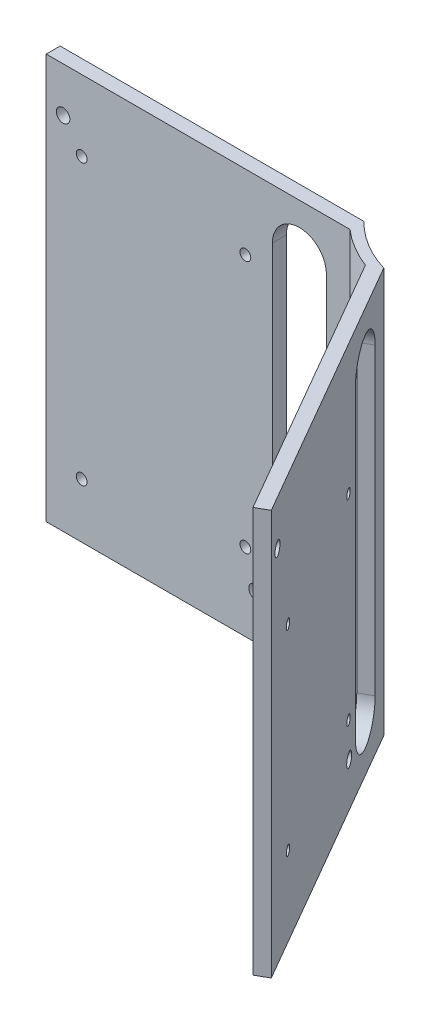
ISO-10303-21;
HEADER;
FILE_DESCRIPTION(('STEP AP214'),'2;1');
FILE_NAME('part.step','',(''),(''),'','','');
FILE_SCHEMA(('AUTOMOTIVE_DESIGN { 1 0 10303 214 1 1 1 1 }'));
ENDSEC;
DATA;
#1=APPLICATION_CONTEXT('core data for automotive mechanical design processes');
#2=APPLICATION_PROTOCOL_DEFINITION('international standard','automotive_design',2000,#1);
#3=PRODUCT_CONTEXT('',#1,'mechanical');
#4=PRODUCT('Part','Part','',(#3));
#5=PRODUCT_RELATED_PRODUCT_CATEGORY('part','',(#4));
#6=PRODUCT_DEFINITION_FORMATION('','',#4);
#7=PRODUCT_DEFINITION_CONTEXT('part definition',#1,'design');
#8=PRODUCT_DEFINITION('design','',#6,#7);
#9=PRODUCT_DEFINITION_SHAPE('','',#8);
#10=(LENGTH_UNIT() NAMED_UNIT(*) SI_UNIT(.MILLI.,.METRE.));
#11=(NAMED_UNIT(*) PLANE_ANGLE_UNIT() SI_UNIT($,.RADIAN.));
#12=(NAMED_UNIT(*) SI_UNIT($,.STERADIAN.) SOLID_ANGLE_UNIT());
#13=UNCERTAINTY_MEASURE_WITH_UNIT(LENGTH_MEASURE(1.E-05),#10,'distance_accuracy_value','');
#14=(GEOMETRIC_REPRESENTATION_CONTEXT(3) GLOBAL_UNCERTAINTY_ASSIGNED_CONTEXT((#13)) GLOBAL_UNIT_ASSIGNED_CONTEXT((#10,
#11,#12)) REPRESENTATION_CONTEXT('',''));
#15=CARTESIAN_POINT('',(0.,0.,0.));
#16=DIRECTION('',(0.,0.,1.));
#17=DIRECTION('',(1.,0.,0.));
#18=AXIS2_PLACEMENT_3D('',#15,#16,#17);
#19=CARTESIAN_POINT('',(0.,120.,28.6181760425084));
#20=DIRECTION('',(0.,0.,1.));
#21=DIRECTION('',(1.,0.,0.));
#22=AXIS2_PLACEMENT_3D('',#19,#20,#21);
#23=PLANE('',#22);
#24=CARTESIAN_POINT('',(-53.,13.,28.6181760425084));
#25=DIRECTION('',(0.,0.,1.));
#26=DIRECTION('',(1.,0.,0.));
#27=AXIS2_PLACEMENT_3D('',#24,#25,#26);
#28=CIRCLE('',#27,2.);
#29=CARTESIAN_POINT('',(-51.,13.,28.6181760425084));
#30=VERTEX_POINT('',#29);
#31=EDGE_CURVE('E691',#30,#30,#28,.T.);
#32=ORIENTED_EDGE('',*,*,#31,.F.);
#33=EDGE_LOOP('',(#32));
#34=FACE_BOUND('',#33,.T.);
#35=CARTESIAN_POINT('',(-104.5,16.199999999999,28.6181760425084));
#36=DIRECTION('',(0.,0.,1.));
#37=DIRECTION('',(1.,0.,0.));
#38=AXIS2_PLACEMENT_3D('',#35,#36,#37);
#39=CIRCLE('',#38,1.60000000000001);
#40=CARTESIAN_POINT('',(-102.9,16.199999999999,28.6181760425084));
#41=VERTEX_POINT('',#40);
#42=EDGE_CURVE('E714',#41,#41,#39,.T.);
#43=ORIENTED_EDGE('',*,*,#42,.F.);
#44=EDGE_LOOP('',(#43));
#45=FACE_BOUND('',#44,.T.);
#46=CARTESIAN_POINT('',(-56.0000000000009,97.9999999999995,28.6181760425084));
#47=DIRECTION('',(0.,0.,1.));
#48=DIRECTION('',(1.,0.,0.));
#49=AXIS2_PLACEMENT_3D('',#46,#47,#48);
#50=CIRCLE('',#49,1.6);
#51=CARTESIAN_POINT('',(-54.4000000000009,97.9999999999995,28.6181760425084));
#52=VERTEX_POINT('',#51);
#53=EDGE_CURVE('E705',#52,#52,#50,.T.);
#54=ORIENTED_EDGE('',*,*,#53,.F.);
#55=EDGE_LOOP('',(#54));
#56=FACE_BOUND('',#55,.T.);
#57=CARTESIAN_POINT('',(-104.500000000001,98.999999999999,28.6181760425084));
#58=DIRECTION('',(0.,0.,1.));
#59=DIRECTION('',(1.,0.,0.));
#60=AXIS2_PLACEMENT_3D('',#57,#58,#59);
#61=CIRCLE('',#60,1.6);
#62=CARTESIAN_POINT('',(-102.900000000001,98.999999999999,28.6181760425084));
#63=VERTEX_POINT('',#62);
#64=EDGE_CURVE('E697',#63,#63,#61,.T.);
#65=ORIENTED_EDGE('',*,*,#64,.F.);
#66=EDGE_LOOP('',(#65));
#67=FACE_BOUND('',#66,.T.);
#68=CARTESIAN_POINT('',(-56.0000000000001,22.9999999999995,28.6181760425084));
#69=DIRECTION('',(0.,0.,1.));
#70=DIRECTION('',(1.,0.,0.));
#71=AXIS2_PLACEMENT_3D('',#68,#69,#70);
#72=CIRCLE('',#71,1.6);
#73=CARTESIAN_POINT('',(-54.4000000000001,22.9999999999995,28.6181760425084));
#74=VERTEX_POINT('',#73);
#75=EDGE_CURVE('E713',#74,#74,#72,.T.);
#76=ORIENTED_EDGE('',*,*,#75,.F.);
#77=EDGE_LOOP('',(#76));
#78=FACE_BOUND('',#77,.T.);
#79=CARTESIAN_POINT('',(-110.,106.75,28.6181760425084));
#80=DIRECTION('',(0.,0.,1.));
#81=DIRECTION('',(1.,0.,0.));
#82=AXIS2_PLACEMENT_3D('',#79,#80,#81);
#83=CIRCLE('',#82,2.);
#84=CARTESIAN_POINT('',(-108.,106.75,28.6181760425084));
#85=VERTEX_POINT('',#84);
#86=EDGE_CURVE('E328',#85,#85,#83,.T.);
#87=ORIENTED_EDGE('',*,*,#86,.F.);
#88=EDGE_LOOP('',(#87));
#89=FACE_BOUND('',#88,.T.);
#90=CARTESIAN_POINT('',(-40.,105.,28.6181760425084));
#91=DIRECTION('',(0.,0.,1.));
#92=DIRECTION('',(-1.,0.,0.));
#93=AXIS2_PLACEMENT_3D('',#90,#91,#92);
#94=CIRCLE('',#93,8.);
#95=CARTESIAN_POINT('',(-32.,105.,28.6181760425084));
#96=VERTEX_POINT('',#95);
#97=CARTESIAN_POINT('',(-48.,105.,28.6181760425084));
#98=VERTEX_POINT('',#97);
#99=EDGE_CURVE('E185',#96,#98,#94,.T.);
#100=ORIENTED_EDGE('',*,*,#99,.F.);
#101=DIRECTION('',(0.,1.,0.));
#102=VECTOR('',#101,1.);
#103=CARTESIAN_POINT('',(-32.,105.,28.6181760425084));
#104=LINE('',#103,#102);
#105=CARTESIAN_POINT('',(-32.,15.,28.6181760425084));
#106=VERTEX_POINT('',#105);
#107=EDGE_CURVE('E195',#106,#96,#104,.T.);
#108=ORIENTED_EDGE('',*,*,#107,.F.);
#109=CARTESIAN_POINT('',(-40.,15.,28.6181760425084));
#110=DIRECTION('',(0.,0.,1.));
#111=DIRECTION('',(1.,0.,0.));
#112=AXIS2_PLACEMENT_3D('',#109,#110,#111);
#113=CIRCLE('',#112,8.00000000000001);
#114=CARTESIAN_POINT('',(-48.,15.,28.6181760425084));
#115=VERTEX_POINT('',#114);
#116=EDGE_CURVE('E214',#115,#106,#113,.T.);
#117=ORIENTED_EDGE('',*,*,#116,.F.);
#118=DIRECTION('',(0.,-1.,0.));
#119=VECTOR('',#118,1.);
#120=CARTESIAN_POINT('',(-48.,105.,28.6181760425084));
#121=LINE('',#120,#119);
#122=EDGE_CURVE('E210',#98,#115,#121,.T.);
#123=ORIENTED_EDGE('',*,*,#122,.F.);
#124=EDGE_LOOP('',(#100,#108,#117,#123));
#125=FACE_BOUND('',#124,.T.);
#126=DIRECTION('',(-1.,0.,0.));
#127=VECTOR('',#126,1.);
#128=CARTESIAN_POINT('',(0.,0.,28.6181760425084));
#129=LINE('',#128,#127);
#130=CARTESIAN_POINT('',(-25.,0.,28.6181760425084));
#131=VERTEX_POINT('',#130);
#132=CARTESIAN_POINT('',(-115.,0.,28.6181760425084));
#133=VERTEX_POINT('',#132);
#134=EDGE_CURVE('E224',#131,#133,#129,.T.);
#135=ORIENTED_EDGE('',*,*,#134,.F.);
#136=DIRECTION('',(0.,-1.,0.));
#137=VECTOR('',#136,1.);
#138=CARTESIAN_POINT('',(-25.,120.,28.6181760425084));
#139=LINE('',#138,#137);
#140=CARTESIAN_POINT('',(-25.,120.,28.6181760425084));
#141=VERTEX_POINT('',#140);
#142=EDGE_CURVE('E314',#141,#131,#139,.T.);
#143=ORIENTED_EDGE('',*,*,#142,.F.);
#144=DIRECTION('',(-1.,0.,0.));
#145=VECTOR('',#144,1.);
#146=CARTESIAN_POINT('',(0.,120.,28.6181760425084));
#147=LINE('',#146,#145);
#148=CARTESIAN_POINT('',(-115.,120.,28.6181760425084));
#149=VERTEX_POINT('',#148);
#150=EDGE_CURVE('E234',#141,#149,#147,.T.);
#151=ORIENTED_EDGE('',*,*,#150,.T.);
#152=DIRECTION('',(0.,-1.,0.));
#153=VECTOR('',#152,1.);
#154=CARTESIAN_POINT('',(-115.,120.,28.6181760425084));
#155=LINE('',#154,#153);
#156=EDGE_CURVE('E263',#149,#133,#155,.T.);
#157=ORIENTED_EDGE('',*,*,#156,.T.);
#158=EDGE_LOOP('',(#135,#143,#151,#157));
#159=FACE_BOUND('',#158,.T.);
#160=ADVANCED_FACE('F40',(#34,#45,#56,#67,#78,#89,#125,#159),#23,.T.);
#161=CARTESIAN_POINT('',(0.,120.,0.));
#162=DIRECTION('',(0.,-1.,0.));
#163=DIRECTION('',(0.,0.,-1.));
#164=AXIS2_PLACEMENT_3D('',#161,#162,#163);
#165=CYLINDRICAL_SURFACE('',#164,38.);
#166=CARTESIAN_POINT('',(0.,0.,0.));
#167=DIRECTION('',(0.,1.,0.));
#168=DIRECTION('',(0.,0.,1.));
#169=AXIS2_PLACEMENT_3D('',#166,#167,#168);
#170=CIRCLE('',#169,38.);
#171=CARTESIAN_POINT('',(-13.5526310368752,0.,35.5010731102361));
#172=VERTEX_POINT('',#171);
#173=EDGE_CURVE('E267',#131,#172,#170,.T.);
#174=ORIENTED_EDGE('',*,*,#173,.T.);
#175=DIRECTION('',(0.,-1.,0.));
#176=VECTOR('',#175,1.);
#177=CARTESIAN_POINT('',(-13.5526310368752,120.,35.5010731102361));
#178=LINE('',#177,#176);
#179=CARTESIAN_POINT('',(-13.5526310368752,120.,35.5010731102361));
#180=VERTEX_POINT('',#179);
#181=EDGE_CURVE('E310',#180,#172,#178,.T.);
#182=ORIENTED_EDGE('',*,*,#181,.F.);
#183=CARTESIAN_POINT('',(0.,120.,0.));
#184=DIRECTION('',(0.,1.,0.));
#185=DIRECTION('',(0.,0.,1.));
#186=AXIS2_PLACEMENT_3D('',#183,#184,#185);
#187=CIRCLE('',#186,38.);
#188=EDGE_CURVE('E238',#141,#180,#187,.T.);
#189=ORIENTED_EDGE('',*,*,#188,.F.);
#190=ORIENTED_EDGE('',*,*,#142,.T.);
#191=EDGE_LOOP('',(#174,#182,#189,#190));
#192=FACE_BOUND('',#191,.T.);
#193=ADVANCED_FACE('F368',(#192),#165,.T.);
#194=CARTESIAN_POINT('',(-25.5368888651929,120.,14.7437296605847));
#195=DIRECTION('',(0.866025403784439,0.,-0.5));
#196=DIRECTION('',(-0.5,0.,-0.866025403784439));
#197=AXIS2_PLACEMENT_3D('',#194,#195,#196);
#198=PLANE('',#197);
#199=CARTESIAN_POINT('',(0.447368963124837,13.,59.7497844162004));
#200=DIRECTION('',(-0.866025403784439,0.,0.5));
#201=DIRECTION('',(0.5,0.,0.866025403784439));
#202=AXIS2_PLACEMENT_3D('',#199,#200,#201);
#203=CIRCLE('',#202,2.00000000000001);
#204=CARTESIAN_POINT('',(1.44736896312484,13.,61.4818352237693));
#205=VERTEX_POINT('',#204);
#206=EDGE_CURVE('E687',#205,#205,#203,.T.);
#207=ORIENTED_EDGE('',*,*,#206,.F.);
#208=EDGE_LOOP('',(#207));
#209=FACE_BOUND('',#208,.T.);
#210=CARTESIAN_POINT('',(25.213111134807,81.585512482194,102.645308144705));
#211=DIRECTION('',(-0.866025403784439,0.,0.5));
#212=DIRECTION('',(0.5,0.,0.866025403784439));
#213=AXIS2_PLACEMENT_3D('',#210,#211,#212);
#214=CIRCLE('',#213,1.3644997127938);
#215=CARTESIAN_POINT('',(25.8953609912039,81.585512482194,103.826999559441));
#216=VERTEX_POINT('',#215);
#217=EDGE_CURVE('E729',#216,#216,#214,.T.);
#218=ORIENTED_EDGE('',*,*,#217,.F.);
#219=EDGE_LOOP('',(#218));
#220=FACE_BOUND('',#219,.T.);
#221=CARTESIAN_POINT('',(0.713111134806949,81.5855124821939,60.2100633592675));
#222=DIRECTION('',(-0.866025403784439,0.,0.5));
#223=DIRECTION('',(0.5,0.,0.866025403784439));
#224=AXIS2_PLACEMENT_3D('',#221,#222,#223);
#225=CIRCLE('',#224,1.3644997127938);
#226=CARTESIAN_POINT('',(1.39536099120385,81.5855124821939,61.3917547740035));
#227=VERTEX_POINT('',#226);
#228=EDGE_CURVE('E737',#227,#227,#225,.T.);
#229=ORIENTED_EDGE('',*,*,#228,.F.);
#230=EDGE_LOOP('',(#229));
#231=FACE_BOUND('',#230,.T.);
#232=CARTESIAN_POINT('',(0.71311113480705,23.5000000000009,60.2100633592677));
#233=DIRECTION('',(-0.866025403784439,0.,0.5));
#234=DIRECTION('',(0.5,0.,0.866025403784439));
#235=AXIS2_PLACEMENT_3D('',#232,#233,#234);
#236=CIRCLE('',#235,1.3644997127938);
#237=CARTESIAN_POINT('',(1.39536099120395,23.5000000000009,61.3917547740037));
#238=VERTEX_POINT('',#237);
#239=EDGE_CURVE('E733',#238,#238,#236,.T.);
#240=ORIENTED_EDGE('',*,*,#239,.F.);
#241=EDGE_LOOP('',(#240));
#242=FACE_BOUND('',#241,.T.);
#243=CARTESIAN_POINT('',(25.2131111348071,23.500000000001,102.645308144705));
#244=DIRECTION('',(-0.866025403784439,0.,0.5));
#245=DIRECTION('',(0.5,0.,0.866025403784439));
#246=AXIS2_PLACEMENT_3D('',#243,#244,#245);
#247=CIRCLE('',#246,1.3644997127938);
#248=CARTESIAN_POINT('',(25.895360991204,23.500000000001,103.826999559441));
#249=VERTEX_POINT('',#248);
#250=EDGE_CURVE('E335',#249,#249,#247,.T.);
#251=ORIENTED_EDGE('',*,*,#250,.F.);
#252=EDGE_LOOP('',(#251));
#253=FACE_BOUND('',#252,.T.);
#254=CARTESIAN_POINT('',(29.4631111348071,106.75,110.006524076873));
#255=DIRECTION('',(-0.866025403784439,0.,0.5));
#256=DIRECTION('',(0.5,0.,0.866025403784439));
#257=AXIS2_PLACEMENT_3D('',#254,#255,#256);
#258=CIRCLE('',#257,2.);
#259=CARTESIAN_POINT('',(30.4631111348071,106.75,111.738574884442));
#260=VERTEX_POINT('',#259);
#261=EDGE_CURVE('E329',#260,#260,#258,.T.);
#262=ORIENTED_EDGE('',*,*,#261,.F.);
#263=EDGE_LOOP('',(#262));
#264=FACE_BOUND('',#263,.T.);
#265=DIRECTION('',(0.,-1.,0.));
#266=VECTOR('',#265,1.);
#267=CARTESIAN_POINT('',(-10.0526310368752,105.,41.5632509367272));
#268=LINE('',#267,#266);
#269=CARTESIAN_POINT('',(-10.0526310368752,105.,41.5632509367272));
#270=VERTEX_POINT('',#269);
#271=CARTESIAN_POINT('',(-10.0526310368752,15.,41.5632509367272));
#272=VERTEX_POINT('',#271);
#273=EDGE_CURVE('E167',#270,#272,#268,.T.);
#274=ORIENTED_EDGE('',*,*,#273,.F.);
#275=CARTESIAN_POINT('',(-6.05263103687518,105.,48.4914541670027));
#276=DIRECTION('',(-0.866025403784439,0.,0.5));
#277=DIRECTION('',(0.5,0.,0.866025403784439));
#278=AXIS2_PLACEMENT_3D('',#275,#276,#277);
#279=CIRCLE('',#278,8.);
#280=CARTESIAN_POINT('',(-2.05263103687518,105.,55.4196573972782));
#281=VERTEX_POINT('',#280);
#282=EDGE_CURVE('E57',#281,#270,#279,.T.);
#283=ORIENTED_EDGE('',*,*,#282,.F.);
#284=DIRECTION('',(0.,1.,0.));
#285=VECTOR('',#284,1.);
#286=CARTESIAN_POINT('',(-2.05263103687518,105.,55.4196573972782));
#287=LINE('',#286,#285);
#288=CARTESIAN_POINT('',(-2.05263103687518,15.,55.4196573972782));
#289=VERTEX_POINT('',#288);
#290=EDGE_CURVE('E175',#289,#281,#287,.T.);
#291=ORIENTED_EDGE('',*,*,#290,.F.);
#292=CARTESIAN_POINT('',(-6.05263103687518,15.,48.4914541670027));
#293=DIRECTION('',(-0.866025403784439,0.,0.5));
#294=DIRECTION('',(-0.5,0.,-0.866025403784439));
#295=AXIS2_PLACEMENT_3D('',#292,#293,#294);
#296=CIRCLE('',#295,8.);
#297=EDGE_CURVE('E157',#272,#289,#296,.T.);
#298=ORIENTED_EDGE('',*,*,#297,.F.);
#299=EDGE_LOOP('',(#274,#283,#291,#298));
#300=FACE_BOUND('',#299,.T.);
#301=DIRECTION('',(0.5,0.,0.866025403784439));
#302=VECTOR('',#301,1.);
#303=CARTESIAN_POINT('',(-25.5368888651929,0.,14.7437296605847));
#304=LINE('',#303,#302);
#305=CARTESIAN_POINT('',(31.9631111348071,0.,114.336651095795));
#306=VERTEX_POINT('',#305);
#307=EDGE_CURVE('E270',#172,#306,#304,.T.);
#308=ORIENTED_EDGE('',*,*,#307,.T.);
#309=DIRECTION('',(0.,-1.,0.));
#310=VECTOR('',#309,1.);
#311=CARTESIAN_POINT('',(31.9631111348071,120.,114.336651095795));
#312=LINE('',#311,#310);
#313=CARTESIAN_POINT('',(31.9631111348071,120.,114.336651095795));
#314=VERTEX_POINT('',#313);
#315=EDGE_CURVE('E306',#314,#306,#312,.T.);
#316=ORIENTED_EDGE('',*,*,#315,.F.);
#317=DIRECTION('',(0.5,0.,0.866025403784439));
#318=VECTOR('',#317,1.);
#319=CARTESIAN_POINT('',(-25.5368888651929,120.,14.7437296605847));
#320=LINE('',#319,#318);
#321=EDGE_CURVE('E242',#180,#314,#320,.T.);
#322=ORIENTED_EDGE('',*,*,#321,.F.);
#323=ORIENTED_EDGE('',*,*,#181,.T.);
#324=EDGE_LOOP('',(#308,#316,#322,#323));
#325=FACE_BOUND('',#324,.T.);
#326=ADVANCED_FACE('F172',(#209,#220,#231,#242,#253,#264,#300,#325),#198,.F.);
#327=CARTESIAN_POINT('',(57.5000000000002,120.,99.5929214352103));
#328=DIRECTION('',(-0.500000000000002,0.,-0.866025403784438));
#329=DIRECTION('',(-0.866025403784438,0.,0.500000000000002));
#330=AXIS2_PLACEMENT_3D('',#327,#328,#329);
#331=PLANE('',#330);
#332=DIRECTION('',(0.866025403784438,0.,-0.500000000000002));
#333=VECTOR('',#332,1.);
#334=CARTESIAN_POINT('',(57.5000000000002,0.,99.5929214352103));
#335=LINE('',#334,#333);
#336=CARTESIAN_POINT('',(35.411933246361,0.,112.345472721302));
#337=VERTEX_POINT('',#336);
#338=EDGE_CURVE('E273',#306,#337,#335,.T.);
#339=ORIENTED_EDGE('',*,*,#338,.T.);
#340=DIRECTION('',(0.,-1.,0.));
#341=VECTOR('',#340,1.);
#342=CARTESIAN_POINT('',(35.411933246361,120.,112.345472721302));
#343=LINE('',#342,#341);
#344=CARTESIAN_POINT('',(35.411933246361,120.,112.345472721302));
#345=VERTEX_POINT('',#344);
#346=EDGE_CURVE('E303',#345,#337,#343,.T.);
#347=ORIENTED_EDGE('',*,*,#346,.F.);
#348=DIRECTION('',(0.866025403784438,0.,-0.500000000000002));
#349=VECTOR('',#348,1.);
#350=CARTESIAN_POINT('',(57.5000000000002,120.,99.5929214352103));
#351=LINE('',#350,#349);
#352=EDGE_CURVE('E245',#314,#345,#351,.T.);
#353=ORIENTED_EDGE('',*,*,#352,.F.);
#354=ORIENTED_EDGE('',*,*,#315,.T.);
#355=EDGE_LOOP('',(#339,#347,#353,#354));
#356=FACE_BOUND('',#355,.T.);
#357=ADVANCED_FACE('F400',(#356),#331,.F.);
#358=CARTESIAN_POINT('',(-22.0880667536391,120.,12.752551286092));
#359=DIRECTION('',(0.866025403784438,0.,-0.5));
#360=DIRECTION('',(-0.5,0.,-0.866025403784438));
#361=AXIS2_PLACEMENT_3D('',#358,#359,#360);
#362=PLANE('',#361);
#363=CARTESIAN_POINT('',(3.89619107467871,13.,57.7586060417077));
#364=DIRECTION('',(0.866025403784438,0.,-0.5));
#365=DIRECTION('',(-0.5,0.,-0.866025403784438));
#366=AXIS2_PLACEMENT_3D('',#363,#364,#365);
#367=CIRCLE('',#366,2.00000000000001);
#368=CARTESIAN_POINT('',(2.8961910746787,13.,56.0265552341388));
#369=VERTEX_POINT('',#368);
#370=EDGE_CURVE('E43',#369,#369,#367,.T.);
#371=ORIENTED_EDGE('',*,*,#370,.F.);
#372=EDGE_LOOP('',(#371));
#373=FACE_BOUND('',#372,.T.);
#374=CARTESIAN_POINT('',(28.6619332463608,81.585512482194,100.654129770212));
#375=DIRECTION('',(0.866025403784438,0.,-0.5));
#376=DIRECTION('',(-0.5,0.,-0.866025403784438));
#377=AXIS2_PLACEMENT_3D('',#374,#375,#376);
#378=CIRCLE('',#377,1.3644997127938);
#379=CARTESIAN_POINT('',(27.9796833899639,81.585512482194,99.4724383554763));
#380=VERTEX_POINT('',#379);
#381=EDGE_CURVE('E342',#380,#380,#378,.T.);
#382=ORIENTED_EDGE('',*,*,#381,.F.);
#383=EDGE_LOOP('',(#382));
#384=FACE_BOUND('',#383,.T.);
#385=CARTESIAN_POINT('',(4.16193324636082,81.5855124821939,58.2188849847748));
#386=DIRECTION('',(0.866025403784438,0.,-0.5));
#387=DIRECTION('',(-0.5,0.,-0.866025403784438));
#388=AXIS2_PLACEMENT_3D('',#385,#386,#387);
#389=CIRCLE('',#388,1.3644997127938);
#390=CARTESIAN_POINT('',(3.47968338996392,81.5855124821939,57.0371935700388));
#391=VERTEX_POINT('',#390);
#392=EDGE_CURVE('E339',#391,#391,#389,.T.);
#393=ORIENTED_EDGE('',*,*,#392,.F.);
#394=EDGE_LOOP('',(#393));
#395=FACE_BOUND('',#394,.T.);
#396=CARTESIAN_POINT('',(4.16193324636092,23.5000000000009,58.2188849847749));
#397=DIRECTION('',(0.866025403784438,0.,-0.5));
#398=DIRECTION('',(-0.5,0.,-0.866025403784438));
#399=AXIS2_PLACEMENT_3D('',#396,#397,#398);
#400=CIRCLE('',#399,1.3644997127938);
#401=CARTESIAN_POINT('',(3.47968338996402,23.5000000000009,57.0371935700389));
#402=VERTEX_POINT('',#401);
#403=EDGE_CURVE('E334',#402,#402,#400,.T.);
#404=ORIENTED_EDGE('',*,*,#403,.F.);
#405=EDGE_LOOP('',(#404));
#406=FACE_BOUND('',#405,.T.);
#407=CARTESIAN_POINT('',(28.6619332463609,23.500000000001,100.654129770212));
#408=DIRECTION('',(0.866025403784438,0.,-0.5));
#409=DIRECTION('',(-0.5,0.,-0.866025403784438));
#410=AXIS2_PLACEMENT_3D('',#407,#408,#409);
#411=CIRCLE('',#410,1.3644997127938);
#412=CARTESIAN_POINT('',(27.979683389964,23.500000000001,99.4724383554764));
#413=VERTEX_POINT('',#412);
#414=EDGE_CURVE('E330',#413,#413,#411,.T.);
#415=ORIENTED_EDGE('',*,*,#414,.F.);
#416=EDGE_LOOP('',(#415));
#417=FACE_BOUND('',#416,.T.);
#418=CARTESIAN_POINT('',(32.911933246361,106.75,108.01534570238));
#419=DIRECTION('',(0.866025403784438,0.,-0.5));
#420=DIRECTION('',(-0.5,0.,-0.866025403784438));
#421=AXIS2_PLACEMENT_3D('',#418,#419,#420);
#422=CIRCLE('',#421,2.);
#423=CARTESIAN_POINT('',(31.911933246361,106.75,106.283294894811));
#424=VERTEX_POINT('',#423);
#425=EDGE_CURVE('E324',#424,#424,#422,.T.);
#426=ORIENTED_EDGE('',*,*,#425,.F.);
#427=EDGE_LOOP('',(#426));
#428=FACE_BOUND('',#427,.T.);
#429=CARTESIAN_POINT('',(-2.60380892532131,105.,46.5002757925099));
#430=DIRECTION('',(0.866025403784438,0.,-0.5));
#431=DIRECTION('',(-0.5,0.,-0.866025403784438));
#432=AXIS2_PLACEMENT_3D('',#429,#430,#431);
#433=CIRCLE('',#432,8.);
#434=CARTESIAN_POINT('',(-6.60380892532132,105.,39.5720725622344));
#435=VERTEX_POINT('',#434);
#436=CARTESIAN_POINT('',(1.39619107467868,105.,53.4284790227854));
#437=VERTEX_POINT('',#436);
#438=EDGE_CURVE('E11',#435,#437,#433,.T.);
#439=ORIENTED_EDGE('',*,*,#438,.F.);
#440=DIRECTION('',(0.,1.,0.));
#441=VECTOR('',#440,1.);
#442=CARTESIAN_POINT('',(-6.60380892532132,120.,39.5720725622344));
#443=LINE('',#442,#441);
#444=CARTESIAN_POINT('',(-6.60380892532131,15.,39.5720725622344));
#445=VERTEX_POINT('',#444);
#446=EDGE_CURVE('E317',#445,#435,#443,.T.);
#447=ORIENTED_EDGE('',*,*,#446,.F.);
#448=CARTESIAN_POINT('',(-2.60380892532131,15.,46.5002757925099));
#449=DIRECTION('',(0.866025403784438,0.,-0.5));
#450=DIRECTION('',(-0.5,0.,-0.866025403784438));
#451=AXIS2_PLACEMENT_3D('',#448,#449,#450);
#452=CIRCLE('',#451,8.);
#453=CARTESIAN_POINT('',(1.39619107467869,15.,53.4284790227854));
#454=VERTEX_POINT('',#453);
#455=EDGE_CURVE('E160',#454,#445,#452,.T.);
#456=ORIENTED_EDGE('',*,*,#455,.F.);
#457=DIRECTION('',(0.,-1.,0.));
#458=VECTOR('',#457,1.);
#459=CARTESIAN_POINT('',(1.39619107467869,120.,53.4284790227854));
#460=LINE('',#459,#458);
#461=EDGE_CURVE('E49',#437,#454,#460,.T.);
#462=ORIENTED_EDGE('',*,*,#461,.F.);
#463=EDGE_LOOP('',(#439,#447,#456,#462));
#464=FACE_BOUND('',#463,.T.);
#465=DIRECTION('',(0.5,0.,0.866025403784438));
#466=VECTOR('',#465,1.);
#467=CARTESIAN_POINT('',(-22.0880667536391,0.,12.752551286092));
#468=LINE('',#467,#466);
#469=CARTESIAN_POINT('',(-10.1038089253213,0.,33.5098947357433));
#470=VERTEX_POINT('',#469);
#471=EDGE_CURVE('E277',#470,#337,#468,.T.);
#472=ORIENTED_EDGE('',*,*,#471,.F.);
#473=DIRECTION('',(0.,-1.,0.));
#474=VECTOR('',#473,1.);
#475=CARTESIAN_POINT('',(-10.1038089253213,120.,33.5098947357433));
#476=LINE('',#475,#474);
#477=CARTESIAN_POINT('',(-10.1038089253213,120.,33.5098947357433));
#478=VERTEX_POINT('',#477);
#479=EDGE_CURVE('E300',#478,#470,#476,.T.);
#480=ORIENTED_EDGE('',*,*,#479,.F.);
#481=DIRECTION('',(0.5,0.,0.866025403784438));
#482=VECTOR('',#481,1.);
#483=CARTESIAN_POINT('',(-22.0880667536391,120.,12.752551286092));
#484=LINE('',#483,#482);
#485=EDGE_CURVE('E248',#478,#345,#484,.T.);
#486=ORIENTED_EDGE('',*,*,#485,.T.);
#487=ORIENTED_EDGE('',*,*,#346,.T.);
#488=EDGE_LOOP('',(#472,#480,#486,#487));
#489=FACE_BOUND('',#488,.T.);
#490=ADVANCED_FACE('F396',(#373,#384,#395,#406,#417,#428,#464,#489),#362,.T.);
#491=CARTESIAN_POINT('',(0.,120.,0.));
#492=DIRECTION('',(0.,-1.,0.));
#493=DIRECTION('',(0.,0.,-1.));
#494=AXIS2_PLACEMENT_3D('',#491,#492,#493);
#495=CYLINDRICAL_SURFACE('',#494,35.);
#496=CARTESIAN_POINT('',(0.,0.,0.));
#497=DIRECTION('',(0.,1.,0.));
#498=DIRECTION('',(0.,0.,1.));
#499=AXIS2_PLACEMENT_3D('',#496,#497,#498);
#500=CIRCLE('',#499,35.);
#501=CARTESIAN_POINT('',(-25.,0.,24.4948974278318));
#502=VERTEX_POINT('',#501);
#503=EDGE_CURVE('E281',#502,#470,#500,.T.);
#504=ORIENTED_EDGE('',*,*,#503,.F.);
#505=DIRECTION('',(0.,-1.,0.));
#506=VECTOR('',#505,1.);
#507=CARTESIAN_POINT('',(-25.,120.,24.4948974278318));
#508=LINE('',#507,#506);
#509=CARTESIAN_POINT('',(-25.,120.,24.4948974278318));
#510=VERTEX_POINT('',#509);
#511=EDGE_CURVE('E297',#510,#502,#508,.T.);
#512=ORIENTED_EDGE('',*,*,#511,.F.);
#513=CARTESIAN_POINT('',(0.,120.,0.));
#514=DIRECTION('',(0.,1.,0.));
#515=DIRECTION('',(0.,0.,1.));
#516=AXIS2_PLACEMENT_3D('',#513,#514,#515);
#517=CIRCLE('',#516,35.);
#518=EDGE_CURVE('E252',#510,#478,#517,.T.);
#519=ORIENTED_EDGE('',*,*,#518,.T.);
#520=ORIENTED_EDGE('',*,*,#479,.T.);
#521=EDGE_LOOP('',(#504,#512,#519,#520));
#522=FACE_BOUND('',#521,.T.);
#523=ADVANCED_FACE('F391',(#522),#495,.F.);
#524=CARTESIAN_POINT('',(0.,120.,24.4948974278318));
#525=DIRECTION('',(0.,0.,1.));
#526=DIRECTION('',(1.,0.,0.));
#527=AXIS2_PLACEMENT_3D('',#524,#525,#526);
#528=PLANE('',#527);
#529=CARTESIAN_POINT('',(-53.,13.,24.4948974278318));
#530=DIRECTION('',(0.,0.,1.));
#531=DIRECTION('',(1.,0.,0.));
#532=AXIS2_PLACEMENT_3D('',#529,#530,#531);
#533=CIRCLE('',#532,2.);
#534=CARTESIAN_POINT('',(-51.,13.,24.4948974278318));
#535=VERTEX_POINT('',#534);
#536=EDGE_CURVE('E693',#535,#535,#533,.T.);
#537=ORIENTED_EDGE('',*,*,#536,.T.);
#538=EDGE_LOOP('',(#537));
#539=FACE_BOUND('',#538,.T.);
#540=CARTESIAN_POINT('',(-104.5,16.199999999999,24.4948974278318));
#541=DIRECTION('',(0.,0.,1.));
#542=DIRECTION('',(1.,0.,0.));
#543=AXIS2_PLACEMENT_3D('',#540,#541,#542);
#544=CIRCLE('',#543,1.60000000000001);
#545=CARTESIAN_POINT('',(-102.9,16.199999999999,24.4948974278318));
#546=VERTEX_POINT('',#545);
#547=EDGE_CURVE('E709',#546,#546,#544,.T.);
#548=ORIENTED_EDGE('',*,*,#547,.T.);
#549=EDGE_LOOP('',(#548));
#550=FACE_BOUND('',#549,.T.);
#551=CARTESIAN_POINT('',(-56.0000000000009,97.9999999999995,24.4948974278318));
#552=DIRECTION('',(0.,0.,1.));
#553=DIRECTION('',(1.,0.,0.));
#554=AXIS2_PLACEMENT_3D('',#551,#552,#553);
#555=CIRCLE('',#554,1.6);
#556=CARTESIAN_POINT('',(-54.4000000000009,97.9999999999995,24.4948974278318));
#557=VERTEX_POINT('',#556);
#558=EDGE_CURVE('E718',#557,#557,#555,.T.);
#559=ORIENTED_EDGE('',*,*,#558,.T.);
#560=EDGE_LOOP('',(#559));
#561=FACE_BOUND('',#560,.T.);
#562=CARTESIAN_POINT('',(-104.500000000001,98.999999999999,24.4948974278318));
#563=DIRECTION('',(0.,0.,1.));
#564=DIRECTION('',(1.,0.,0.));
#565=AXIS2_PLACEMENT_3D('',#562,#563,#564);
#566=CIRCLE('',#565,1.6);
#567=CARTESIAN_POINT('',(-102.900000000001,98.999999999999,24.4948974278318));
#568=VERTEX_POINT('',#567);
#569=EDGE_CURVE('E701',#568,#568,#566,.T.);
#570=ORIENTED_EDGE('',*,*,#569,.T.);
#571=EDGE_LOOP('',(#570));
#572=FACE_BOUND('',#571,.T.);
#573=CARTESIAN_POINT('',(-56.0000000000001,22.9999999999995,24.4948974278318));
#574=DIRECTION('',(0.,0.,1.));
#575=DIRECTION('',(1.,0.,0.));
#576=AXIS2_PLACEMENT_3D('',#573,#574,#575);
#577=CIRCLE('',#576,1.6);
#578=CARTESIAN_POINT('',(-54.4000000000001,22.9999999999995,24.4948974278318));
#579=VERTEX_POINT('',#578);
#580=EDGE_CURVE('E725',#579,#579,#577,.T.);
#581=ORIENTED_EDGE('',*,*,#580,.T.);
#582=EDGE_LOOP('',(#581));
#583=FACE_BOUND('',#582,.T.);
#584=CARTESIAN_POINT('',(-110.,106.75,24.4948974278318));
#585=DIRECTION('',(0.,0.,1.));
#586=DIRECTION('',(1.,0.,0.));
#587=AXIS2_PLACEMENT_3D('',#584,#585,#586);
#588=CIRCLE('',#587,2.);
#589=CARTESIAN_POINT('',(-108.,106.75,24.4948974278318));
#590=VERTEX_POINT('',#589);
#591=EDGE_CURVE('E355',#590,#590,#588,.T.);
#592=ORIENTED_EDGE('',*,*,#591,.T.);
#593=EDGE_LOOP('',(#592));
#594=FACE_BOUND('',#593,.T.);
#595=DIRECTION('',(0.,1.,0.));
#596=VECTOR('',#595,1.);
#597=CARTESIAN_POINT('',(-32.,105.,24.4948974278318));
#598=LINE('',#597,#596);
#599=CARTESIAN_POINT('',(-32.,15.,24.4948974278318));
#600=VERTEX_POINT('',#599);
#601=CARTESIAN_POINT('',(-32.,105.,24.4948974278318));
#602=VERTEX_POINT('',#601);
#603=EDGE_CURVE('E203',#600,#602,#598,.T.);
#604=ORIENTED_EDGE('',*,*,#603,.T.);
#605=CARTESIAN_POINT('',(-40.,105.,24.4948974278318));
#606=DIRECTION('',(0.,0.,1.));
#607=DIRECTION('',(-1.,0.,0.));
#608=AXIS2_PLACEMENT_3D('',#605,#606,#607);
#609=CIRCLE('',#608,8.);
#610=CARTESIAN_POINT('',(-48.,105.,24.4948974278318));
#611=VERTEX_POINT('',#610);
#612=EDGE_CURVE('E190',#602,#611,#609,.T.);
#613=ORIENTED_EDGE('',*,*,#612,.T.);
#614=DIRECTION('',(0.,-1.,0.));
#615=VECTOR('',#614,1.);
#616=CARTESIAN_POINT('',(-48.,105.,24.4948974278318));
#617=LINE('',#616,#615);
#618=CARTESIAN_POINT('',(-48.,15.,24.4948974278318));
#619=VERTEX_POINT('',#618);
#620=EDGE_CURVE('E194',#611,#619,#617,.T.);
#621=ORIENTED_EDGE('',*,*,#620,.T.);
#622=CARTESIAN_POINT('',(-40.,15.,24.4948974278318));
#623=DIRECTION('',(0.,0.,1.));
#624=DIRECTION('',(1.,0.,0.));
#625=AXIS2_PLACEMENT_3D('',#622,#623,#624);
#626=CIRCLE('',#625,8.00000000000001);
#627=EDGE_CURVE('E199',#619,#600,#626,.T.);
#628=ORIENTED_EDGE('',*,*,#627,.T.);
#629=EDGE_LOOP('',(#604,#613,#621,#628));
#630=FACE_BOUND('',#629,.T.);
#631=DIRECTION('',(-1.,0.,0.));
#632=VECTOR('',#631,1.);
#633=CARTESIAN_POINT('',(0.,0.,24.4948974278318));
#634=LINE('',#633,#632);
#635=CARTESIAN_POINT('',(-115.,0.,24.4948974278318));
#636=VERTEX_POINT('',#635);
#637=EDGE_CURVE('E285',#502,#636,#634,.T.);
#638=ORIENTED_EDGE('',*,*,#637,.T.);
#639=DIRECTION('',(0.,-1.,0.));
#640=VECTOR('',#639,1.);
#641=CARTESIAN_POINT('',(-115.,120.,24.4948974278318));
#642=LINE('',#641,#640);
#643=CARTESIAN_POINT('',(-115.,120.,24.4948974278318));
#644=VERTEX_POINT('',#643);
#645=EDGE_CURVE('E294',#644,#636,#642,.T.);
#646=ORIENTED_EDGE('',*,*,#645,.F.);
#647=DIRECTION('',(-1.,0.,0.));
#648=VECTOR('',#647,1.);
#649=CARTESIAN_POINT('',(0.,120.,24.4948974278318));
#650=LINE('',#649,#648);
#651=EDGE_CURVE('E256',#510,#644,#650,.T.);
#652=ORIENTED_EDGE('',*,*,#651,.F.);
#653=ORIENTED_EDGE('',*,*,#511,.T.);
#654=EDGE_LOOP('',(#638,#646,#652,#653));
#655=FACE_BOUND('',#654,.T.);
#656=ADVANCED_FACE('F388',(#539,#550,#561,#572,#583,#594,#630,#655),#528,.F.);
#657=CARTESIAN_POINT('',(-115.,120.,0.));
#658=DIRECTION('',(-1.,0.,0.));
#659=DIRECTION('',(0.,0.,1.));
#660=AXIS2_PLACEMENT_3D('',#657,#658,#659);
#661=PLANE('',#660);
#662=DIRECTION('',(0.,0.,-1.));
#663=VECTOR('',#662,1.);
#664=CARTESIAN_POINT('',(-115.,0.,0.));
#665=LINE('',#664,#663);
#666=EDGE_CURVE('E239',#133,#636,#665,.T.);
#667=ORIENTED_EDGE('',*,*,#666,.F.);
#668=ORIENTED_EDGE('',*,*,#156,.F.);
#669=DIRECTION('',(0.,0.,-1.));
#670=VECTOR('',#669,1.);
#671=CARTESIAN_POINT('',(-115.,120.,0.));
#672=LINE('',#671,#670);
#673=EDGE_CURVE('E259',#149,#644,#672,.T.);
#674=ORIENTED_EDGE('',*,*,#673,.T.);
#675=ORIENTED_EDGE('',*,*,#645,.T.);
#676=EDGE_LOOP('',(#667,#668,#674,#675));
#677=FACE_BOUND('',#676,.T.);
#678=ADVANCED_FACE('F383',(#677),#661,.T.);
#679=CARTESIAN_POINT('',(0.,120.,0.));
#680=DIRECTION('',(0.,1.,0.));
#681=DIRECTION('',(0.,0.,1.));
#682=AXIS2_PLACEMENT_3D('',#679,#680,#681);
#683=PLANE('',#682);
#684=ORIENTED_EDGE('',*,*,#150,.F.);
#685=ORIENTED_EDGE('',*,*,#188,.T.);
#686=ORIENTED_EDGE('',*,*,#321,.T.);
#687=ORIENTED_EDGE('',*,*,#352,.T.);
#688=ORIENTED_EDGE('',*,*,#485,.F.);
#689=ORIENTED_EDGE('',*,*,#518,.F.);
#690=ORIENTED_EDGE('',*,*,#651,.T.);
#691=ORIENTED_EDGE('',*,*,#673,.F.);
#692=EDGE_LOOP('',(#684,#685,#686,#687,#688,#689,#690,#691));
#693=FACE_BOUND('',#692,.T.);
#694=ADVANCED_FACE('F408',(#693),#683,.T.);
#695=CARTESIAN_POINT('',(0.,0.,0.));
#696=DIRECTION('',(0.,1.,0.));
#697=DIRECTION('',(0.,0.,1.));
#698=AXIS2_PLACEMENT_3D('',#695,#696,#697);
#699=PLANE('',#698);
#700=ORIENTED_EDGE('',*,*,#134,.T.);
#701=ORIENTED_EDGE('',*,*,#666,.T.);
#702=ORIENTED_EDGE('',*,*,#637,.F.);
#703=ORIENTED_EDGE('',*,*,#503,.T.);
#704=ORIENTED_EDGE('',*,*,#471,.T.);
#705=ORIENTED_EDGE('',*,*,#338,.F.);
#706=ORIENTED_EDGE('',*,*,#307,.F.);
#707=ORIENTED_EDGE('',*,*,#173,.F.);
#708=EDGE_LOOP('',(#700,#701,#702,#703,#704,#705,#706,#707));
#709=FACE_BOUND('',#708,.T.);
#710=ADVANCED_FACE('F379',(#709),#699,.F.);
#711=CARTESIAN_POINT('',(-40.,105.,24.4948974278318));
#712=DIRECTION('',(0.,0.,1.));
#713=DIRECTION('',(1.,0.,0.));
#714=AXIS2_PLACEMENT_3D('',#711,#712,#713);
#715=CYLINDRICAL_SURFACE('',#714,8.);
#716=ORIENTED_EDGE('',*,*,#99,.T.);
#717=DIRECTION('',(0.,0.,1.));
#718=VECTOR('',#717,1.);
#719=CARTESIAN_POINT('',(-48.,105.,24.4948974278318));
#720=LINE('',#719,#718);
#721=EDGE_CURVE('E207',#611,#98,#720,.T.);
#722=ORIENTED_EDGE('',*,*,#721,.F.);
#723=ORIENTED_EDGE('',*,*,#612,.F.);
#724=DIRECTION('',(0.,0.,1.));
#725=VECTOR('',#724,1.);
#726=CARTESIAN_POINT('',(-32.,105.,24.4948974278318));
#727=LINE('',#726,#725);
#728=EDGE_CURVE('E221',#602,#96,#727,.T.);
#729=ORIENTED_EDGE('',*,*,#728,.T.);
#730=EDGE_LOOP('',(#716,#722,#723,#729));
#731=FACE_BOUND('',#730,.T.);
#732=ADVANCED_FACE('F415',(#731),#715,.F.);
#733=CARTESIAN_POINT('',(-32.,105.,24.4948974278318));
#734=DIRECTION('',(1.,0.,0.));
#735=DIRECTION('',(0.,1.,0.));
#736=AXIS2_PLACEMENT_3D('',#733,#734,#735);
#737=PLANE('',#736);
#738=ORIENTED_EDGE('',*,*,#107,.T.);
#739=ORIENTED_EDGE('',*,*,#728,.F.);
#740=ORIENTED_EDGE('',*,*,#603,.F.);
#741=DIRECTION('',(0.,0.,1.));
#742=VECTOR('',#741,1.);
#743=CARTESIAN_POINT('',(-32.,15.,24.4948974278318));
#744=LINE('',#743,#742);
#745=EDGE_CURVE('E225',#600,#106,#744,.T.);
#746=ORIENTED_EDGE('',*,*,#745,.T.);
#747=EDGE_LOOP('',(#738,#739,#740,#746));
#748=FACE_BOUND('',#747,.T.);
#749=ADVANCED_FACE('F494',(#748),#737,.F.);
#750=CARTESIAN_POINT('',(-40.,15.,24.4948974278318));
#751=DIRECTION('',(0.,0.,1.));
#752=DIRECTION('',(1.,0.,0.));
#753=AXIS2_PLACEMENT_3D('',#750,#751,#752);
#754=CYLINDRICAL_SURFACE('',#753,8.00000000000001);
#755=ORIENTED_EDGE('',*,*,#116,.T.);
#756=ORIENTED_EDGE('',*,*,#745,.F.);
#757=ORIENTED_EDGE('',*,*,#627,.F.);
#758=DIRECTION('',(0.,0.,1.));
#759=VECTOR('',#758,1.);
#760=CARTESIAN_POINT('',(-48.,15.,24.4948974278318));
#761=LINE('',#760,#759);
#762=EDGE_CURVE('E228',#619,#115,#761,.T.);
#763=ORIENTED_EDGE('',*,*,#762,.T.);
#764=EDGE_LOOP('',(#755,#756,#757,#763));
#765=FACE_BOUND('',#764,.T.);
#766=ADVANCED_FACE('F503',(#765),#754,.F.);
#767=CARTESIAN_POINT('',(-48.,105.,24.4948974278318));
#768=DIRECTION('',(-1.,0.,0.));
#769=DIRECTION('',(0.,-1.,0.));
#770=AXIS2_PLACEMENT_3D('',#767,#768,#769);
#771=PLANE('',#770);
#772=ORIENTED_EDGE('',*,*,#122,.T.);
#773=ORIENTED_EDGE('',*,*,#762,.F.);
#774=ORIENTED_EDGE('',*,*,#620,.F.);
#775=ORIENTED_EDGE('',*,*,#721,.T.);
#776=EDGE_LOOP('',(#772,#773,#774,#775));
#777=FACE_BOUND('',#776,.T.);
#778=ADVANCED_FACE('F513',(#777),#771,.F.);
#779=CARTESIAN_POINT('',(35.4366060452903,105.,24.5376319691423));
#780=DIRECTION('',(-0.866025403784439,0.,0.5));
#781=DIRECTION('',(0.5,0.,0.866025403784439));
#782=AXIS2_PLACEMENT_3D('',#779,#780,#781);
#783=CYLINDRICAL_SURFACE('',#782,8.);
#784=ORIENTED_EDGE('',*,*,#438,.T.);
#785=DIRECTION('',(-0.866025403784439,0.,0.5));
#786=VECTOR('',#785,1.);
#787=CARTESIAN_POINT('',(39.4366060452903,105.,31.4658351994178));
#788=LINE('',#787,#786);
#789=EDGE_CURVE('E182',#437,#281,#788,.T.);
#790=ORIENTED_EDGE('',*,*,#789,.T.);
#791=ORIENTED_EDGE('',*,*,#282,.T.);
#792=DIRECTION('',(-0.866025403784439,0.,0.5));
#793=VECTOR('',#792,1.);
#794=CARTESIAN_POINT('',(31.4366060452903,105.,17.6094287388667));
#795=LINE('',#794,#793);
#796=EDGE_CURVE('E164',#435,#270,#795,.T.);
#797=ORIENTED_EDGE('',*,*,#796,.F.);
#798=EDGE_LOOP('',(#784,#790,#791,#797));
#799=FACE_BOUND('',#798,.T.);
#800=ADVANCED_FACE('F523',(#799),#783,.F.);
#801=CARTESIAN_POINT('',(39.4366060452903,105.,31.4658351994178));
#802=DIRECTION('',(0.5,0.,0.866025403784439));
#803=DIRECTION('',(0.866025403784439,0.,-0.5));
#804=AXIS2_PLACEMENT_3D('',#801,#802,#803);
#805=PLANE('',#804);
#806=ORIENTED_EDGE('',*,*,#461,.T.);
#807=DIRECTION('',(-0.866025403784439,0.,0.5));
#808=VECTOR('',#807,1.);
#809=CARTESIAN_POINT('',(39.4366060452903,15.,31.4658351994178));
#810=LINE('',#809,#808);
#811=EDGE_CURVE('E163',#454,#289,#810,.T.);
#812=ORIENTED_EDGE('',*,*,#811,.T.);
#813=ORIENTED_EDGE('',*,*,#290,.T.);
#814=ORIENTED_EDGE('',*,*,#789,.F.);
#815=EDGE_LOOP('',(#806,#812,#813,#814));
#816=FACE_BOUND('',#815,.T.);
#817=ADVANCED_FACE('F532',(#816),#805,.F.);
#818=CARTESIAN_POINT('',(35.4366060452903,15.,24.5376319691423));
#819=DIRECTION('',(-0.866025403784439,0.,0.5));
#820=DIRECTION('',(0.5,0.,0.866025403784439));
#821=AXIS2_PLACEMENT_3D('',#818,#819,#820);
#822=CYLINDRICAL_SURFACE('',#821,8.);
#823=ORIENTED_EDGE('',*,*,#455,.T.);
#824=DIRECTION('',(-0.866025403784439,0.,0.5));
#825=VECTOR('',#824,1.);
#826=CARTESIAN_POINT('',(31.4366060452903,15.,17.6094287388668));
#827=LINE('',#826,#825);
#828=EDGE_CURVE('E65',#445,#272,#827,.T.);
#829=ORIENTED_EDGE('',*,*,#828,.T.);
#830=ORIENTED_EDGE('',*,*,#297,.T.);
#831=ORIENTED_EDGE('',*,*,#811,.F.);
#832=EDGE_LOOP('',(#823,#829,#830,#831));
#833=FACE_BOUND('',#832,.T.);
#834=ADVANCED_FACE('F154',(#833),#822,.F.);
#835=CARTESIAN_POINT('',(31.4366060452903,105.,17.6094287388667));
#836=DIRECTION('',(-0.5,0.,-0.866025403784439));
#837=DIRECTION('',(-0.866025403784439,0.,0.5));
#838=AXIS2_PLACEMENT_3D('',#835,#836,#837);
#839=PLANE('',#838);
#840=ORIENTED_EDGE('',*,*,#446,.T.);
#841=ORIENTED_EDGE('',*,*,#796,.T.);
#842=ORIENTED_EDGE('',*,*,#273,.T.);
#843=ORIENTED_EDGE('',*,*,#828,.F.);
#844=EDGE_LOOP('',(#840,#841,#842,#843));
#845=FACE_BOUND('',#844,.T.);
#846=ADVANCED_FACE('F168',(#845),#839,.F.);
#847=CARTESIAN_POINT('',(-110.,106.75,24.4948974278318));
#848=DIRECTION('',(0.,0.,1.));
#849=DIRECTION('',(1.,0.,0.));
#850=AXIS2_PLACEMENT_3D('',#847,#848,#849);
#851=CYLINDRICAL_SURFACE('',#850,2.);
#852=ORIENTED_EDGE('',*,*,#591,.F.);
#853=EDGE_LOOP('',(#852));
#854=FACE_BOUND('',#853,.T.);
#855=ORIENTED_EDGE('',*,*,#86,.T.);
#856=EDGE_LOOP('',(#855));
#857=FACE_BOUND('',#856,.T.);
#858=ADVANCED_FACE('F364',(#854,#857),#851,.F.);
#859=CARTESIAN_POINT('',(70.9523482169726,106.75,86.0527018790126));
#860=DIRECTION('',(-0.866025403784439,0.,0.5));
#861=DIRECTION('',(0.5,0.,0.866025403784439));
#862=AXIS2_PLACEMENT_3D('',#859,#860,#861);
#863=CYLINDRICAL_SURFACE('',#862,2.);
#864=ORIENTED_EDGE('',*,*,#425,.T.);
#865=EDGE_LOOP('',(#864));
#866=FACE_BOUND('',#865,.T.);
#867=ORIENTED_EDGE('',*,*,#261,.T.);
#868=EDGE_LOOP('',(#867));
#869=FACE_BOUND('',#868,.T.);
#870=ADVANCED_FACE('F566',(#866,#869),#863,.F.);
#871=CARTESIAN_POINT('',(66.7023482169725,23.500000000001,78.6914859468448));
#872=DIRECTION('',(-0.866025403784439,0.,0.5));
#873=DIRECTION('',(0.5,0.,0.866025403784439));
#874=AXIS2_PLACEMENT_3D('',#871,#872,#873);
#875=CYLINDRICAL_SURFACE('',#874,1.3644997127938);
#876=ORIENTED_EDGE('',*,*,#414,.T.);
#877=EDGE_LOOP('',(#876));
#878=FACE_BOUND('',#877,.T.);
#879=ORIENTED_EDGE('',*,*,#250,.T.);
#880=EDGE_LOOP('',(#879));
#881=FACE_BOUND('',#880,.T.);
#882=ADVANCED_FACE('F576',(#878,#881),#875,.F.);
#883=CARTESIAN_POINT('',(42.2023482169725,23.5000000000009,36.2562411614073));
#884=DIRECTION('',(-0.866025403784439,0.,0.5));
#885=DIRECTION('',(0.5,0.,0.866025403784439));
#886=AXIS2_PLACEMENT_3D('',#883,#884,#885);
#887=CYLINDRICAL_SURFACE('',#886,1.3644997127938);
#888=ORIENTED_EDGE('',*,*,#403,.T.);
#889=EDGE_LOOP('',(#888));
#890=FACE_BOUND('',#889,.T.);
#891=ORIENTED_EDGE('',*,*,#239,.T.);
#892=EDGE_LOOP('',(#891));
#893=FACE_BOUND('',#892,.T.);
#894=ADVANCED_FACE('F586',(#890,#893),#887,.F.);
#895=CARTESIAN_POINT('',(42.2023482169724,81.5855124821939,36.2562411614071));
#896=DIRECTION('',(-0.866025403784439,0.,0.5));
#897=DIRECTION('',(0.5,0.,0.866025403784439));
#898=AXIS2_PLACEMENT_3D('',#895,#896,#897);
#899=CYLINDRICAL_SURFACE('',#898,1.3644997127938);
#900=ORIENTED_EDGE('',*,*,#392,.T.);
#901=EDGE_LOOP('',(#900));
#902=FACE_BOUND('',#901,.T.);
#903=ORIENTED_EDGE('',*,*,#228,.T.);
#904=EDGE_LOOP('',(#903));
#905=FACE_BOUND('',#904,.T.);
#906=ADVANCED_FACE('F596',(#902,#905),#899,.F.);
#907=CARTESIAN_POINT('',(66.7023482169724,81.585512482194,78.6914859468446));
#908=DIRECTION('',(-0.866025403784439,0.,0.5));
#909=DIRECTION('',(0.5,0.,0.866025403784439));
#910=AXIS2_PLACEMENT_3D('',#907,#908,#909);
#911=CYLINDRICAL_SURFACE('',#910,1.3644997127938);
#912=ORIENTED_EDGE('',*,*,#381,.T.);
#913=EDGE_LOOP('',(#912));
#914=FACE_BOUND('',#913,.T.);
#915=ORIENTED_EDGE('',*,*,#217,.T.);
#916=EDGE_LOOP('',(#915));
#917=FACE_BOUND('',#916,.T.);
#918=ADVANCED_FACE('F606',(#914,#917),#911,.F.);
#919=CARTESIAN_POINT('',(-56.0000000000001,22.9999999999995,24.4948974278318));
#920=DIRECTION('',(0.,0.,1.));
#921=DIRECTION('',(1.,0.,0.));
#922=AXIS2_PLACEMENT_3D('',#919,#920,#921);
#923=CYLINDRICAL_SURFACE('',#922,1.6);
#924=ORIENTED_EDGE('',*,*,#75,.T.);
#925=EDGE_LOOP('',(#924));
#926=FACE_BOUND('',#925,.T.);
#927=ORIENTED_EDGE('',*,*,#580,.F.);
#928=EDGE_LOOP('',(#927));
#929=FACE_BOUND('',#928,.T.);
#930=ADVANCED_FACE('F616',(#926,#929),#923,.F.);
#931=CARTESIAN_POINT('',(-104.500000000001,98.999999999999,24.4948974278318));
#932=DIRECTION('',(0.,0.,1.));
#933=DIRECTION('',(1.,0.,0.));
#934=AXIS2_PLACEMENT_3D('',#931,#932,#933);
#935=CYLINDRICAL_SURFACE('',#934,1.6);
#936=ORIENTED_EDGE('',*,*,#64,.T.);
#937=EDGE_LOOP('',(#936));
#938=FACE_BOUND('',#937,.T.);
#939=ORIENTED_EDGE('',*,*,#569,.F.);
#940=EDGE_LOOP('',(#939));
#941=FACE_BOUND('',#940,.T.);
#942=ADVANCED_FACE('F626',(#938,#941),#935,.F.);
#943=CARTESIAN_POINT('',(-56.0000000000009,97.9999999999995,24.4948974278318));
#944=DIRECTION('',(0.,0.,1.));
#945=DIRECTION('',(1.,0.,0.));
#946=AXIS2_PLACEMENT_3D('',#943,#944,#945);
#947=CYLINDRICAL_SURFACE('',#946,1.6);
#948=ORIENTED_EDGE('',*,*,#53,.T.);
#949=EDGE_LOOP('',(#948));
#950=FACE_BOUND('',#949,.T.);
#951=ORIENTED_EDGE('',*,*,#558,.F.);
#952=EDGE_LOOP('',(#951));
#953=FACE_BOUND('',#952,.T.);
#954=ADVANCED_FACE('F637',(#950,#953),#947,.F.);
#955=CARTESIAN_POINT('',(-104.5,16.199999999999,24.4948974278318));
#956=DIRECTION('',(0.,0.,1.));
#957=DIRECTION('',(1.,0.,0.));
#958=AXIS2_PLACEMENT_3D('',#955,#956,#957);
#959=CYLINDRICAL_SURFACE('',#958,1.60000000000001);
#960=ORIENTED_EDGE('',*,*,#42,.T.);
#961=EDGE_LOOP('',(#960));
#962=FACE_BOUND('',#961,.T.);
#963=ORIENTED_EDGE('',*,*,#547,.F.);
#964=EDGE_LOOP('',(#963));
#965=FACE_BOUND('',#964,.T.);
#966=ADVANCED_FACE('F648',(#962,#965),#959,.F.);
#967=CARTESIAN_POINT('',(-53.,13.,24.4948974278318));
#968=DIRECTION('',(0.,0.,1.));
#969=DIRECTION('',(1.,0.,0.));
#970=AXIS2_PLACEMENT_3D('',#967,#968,#969);
#971=CYLINDRICAL_SURFACE('',#970,2.);
#972=ORIENTED_EDGE('',*,*,#536,.F.);
#973=EDGE_LOOP('',(#972));
#974=FACE_BOUND('',#973,.T.);
#975=ORIENTED_EDGE('',*,*,#31,.T.);
#976=EDGE_LOOP('',(#975));
#977=FACE_BOUND('',#976,.T.);
#978=ADVANCED_FACE('F658',(#974,#977),#971,.F.);
#979=CARTESIAN_POINT('',(41.9366060452903,13.,35.79596221834));
#980=DIRECTION('',(-0.866025403784439,0.,0.5));
#981=DIRECTION('',(0.5,0.,0.866025403784439));
#982=AXIS2_PLACEMENT_3D('',#979,#980,#981);
#983=CYLINDRICAL_SURFACE('',#982,2.00000000000001);
#984=ORIENTED_EDGE('',*,*,#370,.T.);
#985=EDGE_LOOP('',(#984));
#986=FACE_BOUND('',#985,.T.);
#987=ORIENTED_EDGE('',*,*,#206,.T.);
#988=EDGE_LOOP('',(#987));
#989=FACE_BOUND('',#988,.T.);
#990=ADVANCED_FACE('F669',(#986,#989),#983,.F.);
#991=CLOSED_SHELL('',(#160,#193,#326,#357,#490,#523,#656,#678,#694,#710,#732,#749,#766,#778,
#800,#817,#834,#846,#858,#870,#882,#894,#906,#918,#930,#942,#954,#966,#978,#990));
#992=MANIFOLD_SOLID_BREP('B2',#991);
#993=ADVANCED_BREP_SHAPE_REPRESENTATION('',(#18,#992),#14);
#994=SHAPE_DEFINITION_REPRESENTATION(#9,#993);
ENDSEC;
END-ISO-10303-21;
